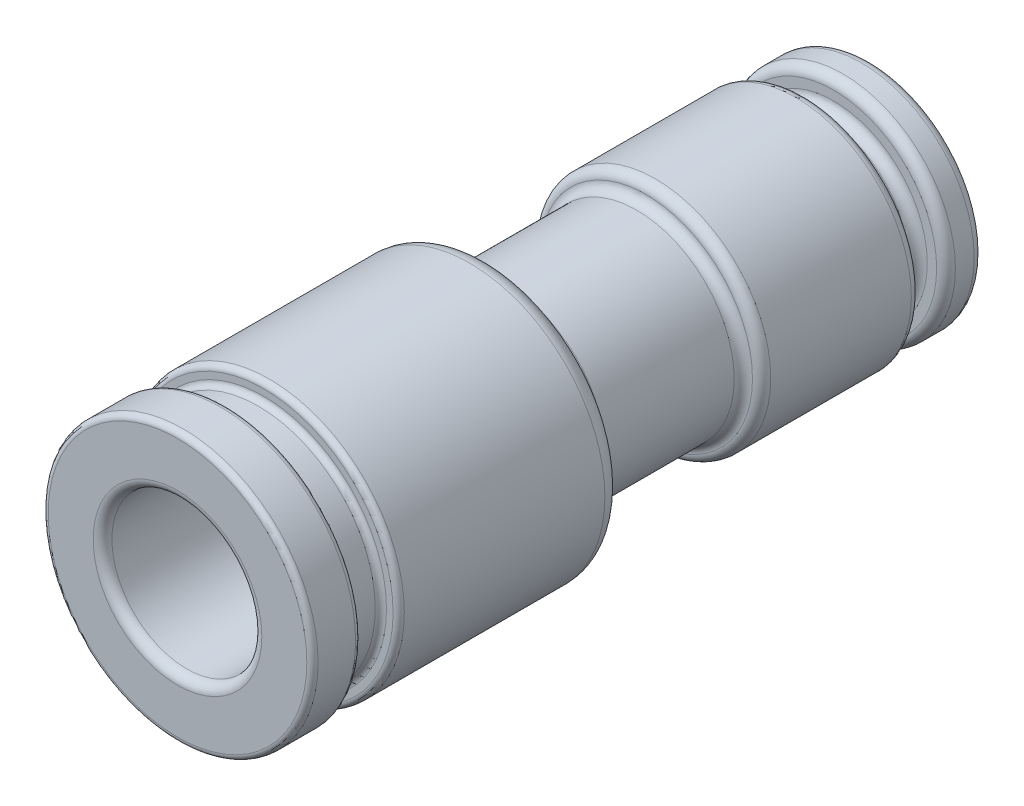
ISO-10303-21;
HEADER;
FILE_DESCRIPTION(('STEP AP214'),'2;1');
FILE_NAME('part.step','',(''),(''),'','','');
FILE_SCHEMA(('AUTOMOTIVE_DESIGN { 1 0 10303 214 1 1 1 1 }'));
ENDSEC;
DATA;
#1=APPLICATION_CONTEXT('core data for automotive mechanical design processes');
#2=APPLICATION_PROTOCOL_DEFINITION('international standard','automotive_design',2000,#1);
#3=PRODUCT_CONTEXT('',#1,'mechanical');
#4=PRODUCT('Part','Part','',(#3));
#5=PRODUCT_RELATED_PRODUCT_CATEGORY('part','',(#4));
#6=PRODUCT_DEFINITION_FORMATION('','',#4);
#7=PRODUCT_DEFINITION_CONTEXT('part definition',#1,'design');
#8=PRODUCT_DEFINITION('design','',#6,#7);
#9=PRODUCT_DEFINITION_SHAPE('','',#8);
#10=(LENGTH_UNIT() NAMED_UNIT(*) SI_UNIT(.MILLI.,.METRE.));
#11=(NAMED_UNIT(*) PLANE_ANGLE_UNIT() SI_UNIT($,.RADIAN.));
#12=(NAMED_UNIT(*) SI_UNIT($,.STERADIAN.) SOLID_ANGLE_UNIT());
#13=UNCERTAINTY_MEASURE_WITH_UNIT(LENGTH_MEASURE(1.E-05),#10,'distance_accuracy_value','');
#14=(GEOMETRIC_REPRESENTATION_CONTEXT(3) GLOBAL_UNCERTAINTY_ASSIGNED_CONTEXT((#13)) GLOBAL_UNIT_ASSIGNED_CONTEXT((#10,
#11,#12)) REPRESENTATION_CONTEXT('',''));
#15=CARTESIAN_POINT('',(0.,0.,0.));
#16=DIRECTION('',(0.,0.,1.));
#17=DIRECTION('',(1.,0.,0.));
#18=AXIS2_PLACEMENT_3D('',#15,#16,#17);
#19=CARTESIAN_POINT('',(0.,0.,2.));
#20=DIRECTION('',(0.,0.,-1.));
#21=DIRECTION('',(-1.,0.,0.));
#22=AXIS2_PLACEMENT_3D('',#19,#20,#21);
#23=CYLINDRICAL_SURFACE('',#22,6.);
#24=CARTESIAN_POINT('',(0.,0.,0.5));
#25=DIRECTION('',(0.,0.,1.));
#26=DIRECTION('',(1.,0.,0.));
#27=AXIS2_PLACEMENT_3D('',#24,#25,#26);
#28=CIRCLE('',#27,6.);
#29=CARTESIAN_POINT('',(6.,0.,0.5));
#30=VERTEX_POINT('',#29);
#31=EDGE_CURVE('E99',#30,#30,#28,.T.);
#32=ORIENTED_EDGE('',*,*,#31,.T.);
#33=EDGE_LOOP('',(#32));
#34=FACE_BOUND('',#33,.T.);
#35=CARTESIAN_POINT('',(0.,0.,1.5));
#36=DIRECTION('',(0.,0.,1.));
#37=DIRECTION('',(1.,0.,0.));
#38=AXIS2_PLACEMENT_3D('',#35,#36,#37);
#39=CIRCLE('',#38,6.);
#40=CARTESIAN_POINT('',(6.,0.,1.5));
#41=VERTEX_POINT('',#40);
#42=EDGE_CURVE('E103',#41,#41,#39,.F.);
#43=ORIENTED_EDGE('',*,*,#42,.T.);
#44=EDGE_LOOP('',(#43));
#45=FACE_BOUND('',#44,.T.);
#46=ADVANCED_FACE('F43',(#34,#45),#23,.T.);
#47=CARTESIAN_POINT('',(0.,0.,2.));
#48=DIRECTION('',(0.,0.,1.));
#49=DIRECTION('',(1.,0.,0.));
#50=AXIS2_PLACEMENT_3D('',#47,#48,#49);
#51=PLANE('',#50);
#52=CARTESIAN_POINT('',(0.,0.,2.));
#53=DIRECTION('',(0.,0.,1.));
#54=DIRECTION('',(1.,0.,0.));
#55=AXIS2_PLACEMENT_3D('',#52,#53,#54);
#56=CIRCLE('',#55,5.5);
#57=CARTESIAN_POINT('',(5.5,0.,2.));
#58=VERTEX_POINT('',#57);
#59=EDGE_CURVE('E87',#58,#58,#56,.T.);
#60=ORIENTED_EDGE('',*,*,#59,.T.);
#61=EDGE_LOOP('',(#60));
#62=FACE_BOUND('',#61,.T.);
#63=CARTESIAN_POINT('',(0.,0.,2.));
#64=DIRECTION('',(0.,0.,1.));
#65=DIRECTION('',(1.,0.,0.));
#66=AXIS2_PLACEMENT_3D('',#63,#64,#65);
#67=CIRCLE('',#66,5.);
#68=CARTESIAN_POINT('',(5.,0.,2.));
#69=VERTEX_POINT('',#68);
#70=EDGE_CURVE('E91',#69,#69,#67,.F.);
#71=ORIENTED_EDGE('',*,*,#70,.T.);
#72=EDGE_LOOP('',(#71));
#73=FACE_BOUND('',#72,.T.);
#74=ADVANCED_FACE('F203',(#62,#73),#51,.T.);
#75=CARTESIAN_POINT('',(0.,0.,0.));
#76=DIRECTION('',(0.,0.,1.));
#77=DIRECTION('',(1.,0.,0.));
#78=AXIS2_PLACEMENT_3D('',#75,#76,#77);
#79=PLANE('',#78);
#80=CARTESIAN_POINT('',(0.,0.,0.));
#81=DIRECTION('',(0.,0.,1.));
#82=DIRECTION('',(1.,0.,0.));
#83=AXIS2_PLACEMENT_3D('',#80,#81,#82);
#84=CIRCLE('',#83,3.5);
#85=CARTESIAN_POINT('',(3.5,0.,0.));
#86=VERTEX_POINT('',#85);
#87=EDGE_CURVE('E51',#86,#86,#84,.T.);
#88=ORIENTED_EDGE('',*,*,#87,.T.);
#89=EDGE_LOOP('',(#88));
#90=FACE_BOUND('',#89,.T.);
#91=CARTESIAN_POINT('',(0.,0.,0.));
#92=DIRECTION('',(0.,0.,1.));
#93=DIRECTION('',(1.,0.,0.));
#94=AXIS2_PLACEMENT_3D('',#91,#92,#93);
#95=CIRCLE('',#94,5.5);
#96=CARTESIAN_POINT('',(5.5,0.,0.));
#97=VERTEX_POINT('',#96);
#98=EDGE_CURVE('E95',#97,#97,#95,.F.);
#99=ORIENTED_EDGE('',*,*,#98,.T.);
#100=EDGE_LOOP('',(#99));
#101=FACE_BOUND('',#100,.T.);
#102=ADVANCED_FACE('F208',(#90,#101),#79,.F.);
#103=CARTESIAN_POINT('',(0.,0.,3.5));
#104=DIRECTION('',(0.,0.,-1.));
#105=DIRECTION('',(-1.,0.,0.));
#106=AXIS2_PLACEMENT_3D('',#103,#104,#105);
#107=CYLINDRICAL_SURFACE('',#106,4.5);
#108=CARTESIAN_POINT('',(0.,0.,2.5));
#109=DIRECTION('',(0.,0.,1.));
#110=DIRECTION('',(1.,0.,0.));
#111=AXIS2_PLACEMENT_3D('',#108,#109,#110);
#112=CIRCLE('',#111,4.5);
#113=CARTESIAN_POINT('',(4.5,0.,2.5));
#114=VERTEX_POINT('',#113);
#115=EDGE_CURVE('E79',#114,#114,#112,.T.);
#116=ORIENTED_EDGE('',*,*,#115,.T.);
#117=EDGE_LOOP('',(#116));
#118=FACE_BOUND('',#117,.T.);
#119=CARTESIAN_POINT('',(0.,0.,3.));
#120=DIRECTION('',(0.,0.,1.));
#121=DIRECTION('',(1.,0.,0.));
#122=AXIS2_PLACEMENT_3D('',#119,#120,#121);
#123=CIRCLE('',#122,4.5);
#124=CARTESIAN_POINT('',(4.5,0.,3.));
#125=VERTEX_POINT('',#124);
#126=EDGE_CURVE('E83',#125,#125,#123,.F.);
#127=ORIENTED_EDGE('',*,*,#126,.T.);
#128=EDGE_LOOP('',(#127));
#129=FACE_BOUND('',#128,.T.);
#130=ADVANCED_FACE('F214',(#118,#129),#107,.T.);
#131=CARTESIAN_POINT('',(0.,0.,12.));
#132=DIRECTION('',(0.,0.,-1.));
#133=DIRECTION('',(-1.,0.,0.));
#134=AXIS2_PLACEMENT_3D('',#131,#132,#133);
#135=CYLINDRICAL_SURFACE('',#134,6.15);
#136=CARTESIAN_POINT('',(0.,0.,4.));
#137=DIRECTION('',(0.,0.,1.));
#138=DIRECTION('',(1.,0.,0.));
#139=AXIS2_PLACEMENT_3D('',#136,#137,#138);
#140=CIRCLE('',#139,6.15);
#141=CARTESIAN_POINT('',(6.15,0.,4.));
#142=VERTEX_POINT('',#141);
#143=EDGE_CURVE('E115',#142,#142,#140,.T.);
#144=ORIENTED_EDGE('',*,*,#143,.T.);
#145=EDGE_LOOP('',(#144));
#146=FACE_BOUND('',#145,.T.);
#147=CARTESIAN_POINT('',(0.,0.,11.5012507822281));
#148=DIRECTION('',(0.,0.,-1.));
#149=DIRECTION('',(-1.,0.,0.));
#150=AXIS2_PLACEMENT_3D('',#147,#148,#149);
#151=CIRCLE('',#150,6.15);
#152=CARTESIAN_POINT('',(-6.15,0.,11.5012507822281));
#153=VERTEX_POINT('',#152);
#154=EDGE_CURVE('E171',#153,#153,#151,.T.);
#155=ORIENTED_EDGE('',*,*,#154,.T.);
#156=EDGE_LOOP('',(#155));
#157=FACE_BOUND('',#156,.T.);
#158=ADVANCED_FACE('F218',(#146,#157),#135,.T.);
#159=CARTESIAN_POINT('',(0.,0.,3.5));
#160=DIRECTION('',(0.,0.,1.));
#161=DIRECTION('',(1.,0.,0.));
#162=AXIS2_PLACEMENT_3D('',#159,#160,#161);
#163=PLANE('',#162);
#164=CARTESIAN_POINT('',(0.,0.,3.5));
#165=DIRECTION('',(0.,0.,1.));
#166=DIRECTION('',(1.,0.,0.));
#167=AXIS2_PLACEMENT_3D('',#164,#165,#166);
#168=CIRCLE('',#167,5.65);
#169=CARTESIAN_POINT('',(5.65,0.,3.5));
#170=VERTEX_POINT('',#169);
#171=EDGE_CURVE('E107',#170,#170,#168,.F.);
#172=ORIENTED_EDGE('',*,*,#171,.T.);
#173=EDGE_LOOP('',(#172));
#174=FACE_BOUND('',#173,.T.);
#175=CARTESIAN_POINT('',(0.,0.,3.5));
#176=DIRECTION('',(0.,0.,1.));
#177=DIRECTION('',(1.,0.,0.));
#178=AXIS2_PLACEMENT_3D('',#175,#176,#177);
#179=CIRCLE('',#178,5.);
#180=CARTESIAN_POINT('',(5.,0.,3.5));
#181=VERTEX_POINT('',#180);
#182=EDGE_CURVE('E111',#181,#181,#179,.T.);
#183=ORIENTED_EDGE('',*,*,#182,.T.);
#184=EDGE_LOOP('',(#183));
#185=FACE_BOUND('',#184,.T.);
#186=ADVANCED_FACE('F198',(#174,#185),#163,.F.);
#187=CARTESIAN_POINT('',(0.,0.,20.4));
#188=DIRECTION('',(0.,0.,-1.));
#189=DIRECTION('',(-1.,0.,0.));
#190=AXIS2_PLACEMENT_3D('',#187,#188,#189);
#191=CYLINDRICAL_SURFACE('',#190,5.2);
#192=CARTESIAN_POINT('',(0.,0.,19.4));
#193=DIRECTION('',(0.,0.,1.));
#194=DIRECTION('',(1.,0.,0.));
#195=AXIS2_PLACEMENT_3D('',#192,#193,#194);
#196=CIRCLE('',#195,5.2);
#197=CARTESIAN_POINT('',(5.2,0.,19.4));
#198=VERTEX_POINT('',#197);
#199=EDGE_CURVE('E163',#198,#198,#196,.F.);
#200=ORIENTED_EDGE('',*,*,#199,.T.);
#201=EDGE_LOOP('',(#200));
#202=FACE_BOUND('',#201,.T.);
#203=CARTESIAN_POINT('',(0.,0.,12.5));
#204=DIRECTION('',(0.,0.,1.));
#205=DIRECTION('',(1.,0.,0.));
#206=AXIS2_PLACEMENT_3D('',#203,#204,#205);
#207=CIRCLE('',#206,5.2);
#208=CARTESIAN_POINT('',(5.2,0.,12.5));
#209=VERTEX_POINT('',#208);
#210=EDGE_CURVE('E179',#209,#209,#207,.T.);
#211=ORIENTED_EDGE('',*,*,#210,.T.);
#212=EDGE_LOOP('',(#211));
#213=FACE_BOUND('',#212,.T.);
#214=ADVANCED_FACE('F184',(#202,#213),#191,.T.);
#215=CARTESIAN_POINT('',(0.,0.,12.5));
#216=DIRECTION('',(0.,0.,1.));
#217=DIRECTION('',(1.,0.,0.));
#218=AXIS2_PLACEMENT_3D('',#215,#216,#217);
#219=TOROIDAL_SURFACE('',#218,5.7,0.5);
#220=CARTESIAN_POINT('',(0.,0.,12.0006253911128));
#221=DIRECTION('',(0.,0.,1.));
#222=DIRECTION('',(1.,0.,0.));
#223=AXIS2_PLACEMENT_3D('',#220,#221,#222);
#224=CIRCLE('',#223,5.67499999999994);
#225=CARTESIAN_POINT('',(5.67499999999994,0.,12.0006253911128));
#226=VERTEX_POINT('',#225);
#227=EDGE_CURVE('E175',#226,#226,#224,.T.);
#228=ORIENTED_EDGE('',*,*,#227,.T.);
#229=EDGE_LOOP('',(#228));
#230=FACE_BOUND('',#229,.T.);
#231=ORIENTED_EDGE('',*,*,#210,.F.);
#232=EDGE_LOOP('',(#231));
#233=FACE_BOUND('',#232,.T.);
#234=ADVANCED_FACE('F186',(#230,#233),#219,.F.);
#235=CARTESIAN_POINT('',(0.,0.,11.5012507822281));
#236=DIRECTION('',(0.,0.,-1.));
#237=DIRECTION('',(-1.,0.,0.));
#238=AXIS2_PLACEMENT_3D('',#235,#236,#237);
#239=TOROIDAL_SURFACE('',#238,5.65,0.5);
#240=ORIENTED_EDGE('',*,*,#154,.F.);
#241=EDGE_LOOP('',(#240));
#242=FACE_BOUND('',#241,.T.);
#243=ORIENTED_EDGE('',*,*,#227,.F.);
#244=EDGE_LOOP('',(#243));
#245=FACE_BOUND('',#244,.T.);
#246=ADVANCED_FACE('F188',(#242,#245),#239,.T.);
#247=CARTESIAN_POINT('',(0.,0.,32.4));
#248=DIRECTION('',(0.,0.,-1.));
#249=DIRECTION('',(-1.,0.,0.));
#250=AXIS2_PLACEMENT_3D('',#247,#248,#249);
#251=CYLINDRICAL_SURFACE('',#250,7.2);
#252=CARTESIAN_POINT('',(0.,0.,32.1));
#253=DIRECTION('',(0.,0.,1.));
#254=DIRECTION('',(1.,0.,0.));
#255=AXIS2_PLACEMENT_3D('',#252,#253,#254);
#256=CIRCLE('',#255,7.2);
#257=CARTESIAN_POINT('',(7.2,0.,32.1));
#258=VERTEX_POINT('',#257);
#259=EDGE_CURVE('E135',#258,#258,#256,.F.);
#260=ORIENTED_EDGE('',*,*,#259,.T.);
#261=EDGE_LOOP('',(#260));
#262=FACE_BOUND('',#261,.T.);
#263=CARTESIAN_POINT('',(0.,0.,21.4));
#264=DIRECTION('',(0.,0.,1.));
#265=DIRECTION('',(1.,0.,0.));
#266=AXIS2_PLACEMENT_3D('',#263,#264,#265);
#267=CIRCLE('',#266,7.2);
#268=CARTESIAN_POINT('',(7.2,0.,21.4));
#269=VERTEX_POINT('',#268);
#270=EDGE_CURVE('E159',#269,#269,#267,.T.);
#271=ORIENTED_EDGE('',*,*,#270,.T.);
#272=EDGE_LOOP('',(#271));
#273=FACE_BOUND('',#272,.T.);
#274=ADVANCED_FACE('F195',(#262,#273),#251,.T.);
#275=CARTESIAN_POINT('',(0.,0.,32.4));
#276=DIRECTION('',(0.,0.,1.));
#277=DIRECTION('',(1.,0.,0.));
#278=AXIS2_PLACEMENT_3D('',#275,#276,#277);
#279=PLANE('',#278);
#280=CARTESIAN_POINT('',(0.,0.,32.4));
#281=DIRECTION('',(0.,0.,1.));
#282=DIRECTION('',(1.,0.,0.));
#283=AXIS2_PLACEMENT_3D('',#280,#281,#282);
#284=CIRCLE('',#283,6.9);
#285=CARTESIAN_POINT('',(6.9,0.,32.4));
#286=VERTEX_POINT('',#285);
#287=EDGE_CURVE('E139',#286,#286,#284,.T.);
#288=ORIENTED_EDGE('',*,*,#287,.T.);
#289=EDGE_LOOP('',(#288));
#290=FACE_BOUND('',#289,.T.);
#291=CARTESIAN_POINT('',(0.,0.,32.4));
#292=DIRECTION('',(0.,0.,1.));
#293=DIRECTION('',(1.,0.,0.));
#294=AXIS2_PLACEMENT_3D('',#291,#292,#293);
#295=CIRCLE('',#294,6.55);
#296=CARTESIAN_POINT('',(6.55,0.,32.4));
#297=VERTEX_POINT('',#296);
#298=EDGE_CURVE('E147',#297,#297,#295,.F.);
#299=ORIENTED_EDGE('',*,*,#298,.T.);
#300=EDGE_LOOP('',(#299));
#301=FACE_BOUND('',#300,.T.);
#302=ADVANCED_FACE('F228',(#290,#301),#279,.T.);
#303=CARTESIAN_POINT('',(0.,0.,19.4));
#304=DIRECTION('',(0.,0.,1.));
#305=DIRECTION('',(1.,0.,0.));
#306=AXIS2_PLACEMENT_3D('',#303,#304,#305);
#307=TOROIDAL_SURFACE('',#306,6.2,1.);
#308=ORIENTED_EDGE('',*,*,#199,.F.);
#309=EDGE_LOOP('',(#308));
#310=FACE_BOUND('',#309,.T.);
#311=CARTESIAN_POINT('',(0.,0.,20.4));
#312=DIRECTION('',(0.,0.,1.));
#313=DIRECTION('',(1.,0.,0.));
#314=AXIS2_PLACEMENT_3D('',#311,#312,#313);
#315=CIRCLE('',#314,6.2);
#316=CARTESIAN_POINT('',(6.2,0.,20.4));
#317=VERTEX_POINT('',#316);
#318=EDGE_CURVE('E167',#317,#317,#315,.T.);
#319=ORIENTED_EDGE('',*,*,#318,.F.);
#320=EDGE_LOOP('',(#319));
#321=FACE_BOUND('',#320,.T.);
#322=ADVANCED_FACE('F232',(#310,#321),#307,.F.);
#323=CARTESIAN_POINT('',(0.,0.,21.4));
#324=DIRECTION('',(0.,0.,1.));
#325=DIRECTION('',(1.,0.,0.));
#326=AXIS2_PLACEMENT_3D('',#323,#324,#325);
#327=TOROIDAL_SURFACE('',#326,6.2,1.);
#328=ORIENTED_EDGE('',*,*,#318,.T.);
#329=EDGE_LOOP('',(#328));
#330=FACE_BOUND('',#329,.T.);
#331=ORIENTED_EDGE('',*,*,#270,.F.);
#332=EDGE_LOOP('',(#331));
#333=FACE_BOUND('',#332,.T.);
#334=ADVANCED_FACE('F238',(#330,#333),#327,.T.);
#335=CARTESIAN_POINT('',(0.,0.,34.4));
#336=DIRECTION('',(0.,0.,-1.));
#337=DIRECTION('',(-1.,0.,0.));
#338=AXIS2_PLACEMENT_3D('',#335,#336,#337);
#339=CYLINDRICAL_SURFACE('',#338,6.25);
#340=CARTESIAN_POINT('',(0.,0.,32.7));
#341=DIRECTION('',(0.,0.,1.));
#342=DIRECTION('',(1.,0.,0.));
#343=AXIS2_PLACEMENT_3D('',#340,#341,#342);
#344=CIRCLE('',#343,6.25);
#345=CARTESIAN_POINT('',(6.25,0.,32.7));
#346=VERTEX_POINT('',#345);
#347=EDGE_CURVE('E151',#346,#346,#344,.T.);
#348=ORIENTED_EDGE('',*,*,#347,.T.);
#349=EDGE_LOOP('',(#348));
#350=FACE_BOUND('',#349,.T.);
#351=CARTESIAN_POINT('',(0.,0.,34.1));
#352=DIRECTION('',(0.,0.,1.));
#353=DIRECTION('',(1.,0.,0.));
#354=AXIS2_PLACEMENT_3D('',#351,#352,#353);
#355=CIRCLE('',#354,6.25);
#356=CARTESIAN_POINT('',(6.25,0.,34.1));
#357=VERTEX_POINT('',#356);
#358=EDGE_CURVE('E155',#357,#357,#355,.F.);
#359=ORIENTED_EDGE('',*,*,#358,.T.);
#360=EDGE_LOOP('',(#359));
#361=FACE_BOUND('',#360,.T.);
#362=ADVANCED_FACE('F234',(#350,#361),#339,.T.);
#363=CARTESIAN_POINT('',(0.,0.,94.3646752981726));
#364=DIRECTION('',(0.,0.,-1.));
#365=DIRECTION('',(-1.,0.,0.));
#366=AXIS2_PLACEMENT_3D('',#363,#364,#365);
#367=CYLINDRICAL_SURFACE('',#366,7.2);
#368=CARTESIAN_POINT('',(0.,0.,36.7));
#369=DIRECTION('',(0.,0.,1.));
#370=DIRECTION('',(1.,0.,0.));
#371=AXIS2_PLACEMENT_3D('',#368,#369,#370);
#372=CIRCLE('',#371,7.2);
#373=CARTESIAN_POINT('',(7.2,0.,36.7));
#374=VERTEX_POINT('',#373);
#375=EDGE_CURVE('E123',#374,#374,#372,.F.);
#376=ORIENTED_EDGE('',*,*,#375,.T.);
#377=EDGE_LOOP('',(#376));
#378=FACE_BOUND('',#377,.T.);
#379=CARTESIAN_POINT('',(0.,0.,34.7));
#380=DIRECTION('',(0.,0.,1.));
#381=DIRECTION('',(1.,0.,0.));
#382=AXIS2_PLACEMENT_3D('',#379,#380,#381);
#383=CIRCLE('',#382,7.2);
#384=CARTESIAN_POINT('',(7.2,0.,34.7));
#385=VERTEX_POINT('',#384);
#386=EDGE_CURVE('E127',#385,#385,#383,.T.);
#387=ORIENTED_EDGE('',*,*,#386,.T.);
#388=EDGE_LOOP('',(#387));
#389=FACE_BOUND('',#388,.T.);
#390=ADVANCED_FACE('F237',(#378,#389),#367,.T.);
#391=CARTESIAN_POINT('',(0.,0.,34.4));
#392=DIRECTION('',(0.,0.,1.));
#393=DIRECTION('',(1.,0.,0.));
#394=AXIS2_PLACEMENT_3D('',#391,#392,#393);
#395=PLANE('',#394);
#396=CARTESIAN_POINT('',(0.,0.,34.4));
#397=DIRECTION('',(0.,0.,1.));
#398=DIRECTION('',(1.,0.,0.));
#399=AXIS2_PLACEMENT_3D('',#396,#397,#398);
#400=CIRCLE('',#399,6.9);
#401=CARTESIAN_POINT('',(6.9,0.,34.4));
#402=VERTEX_POINT('',#401);
#403=EDGE_CURVE('E119',#402,#402,#400,.F.);
#404=ORIENTED_EDGE('',*,*,#403,.T.);
#405=EDGE_LOOP('',(#404));
#406=FACE_BOUND('',#405,.T.);
#407=CARTESIAN_POINT('',(0.,0.,34.4));
#408=DIRECTION('',(0.,0.,1.));
#409=DIRECTION('',(1.,0.,0.));
#410=AXIS2_PLACEMENT_3D('',#407,#408,#409);
#411=CIRCLE('',#410,6.55);
#412=CARTESIAN_POINT('',(6.55,0.,34.4));
#413=VERTEX_POINT('',#412);
#414=EDGE_CURVE('E143',#413,#413,#411,.T.);
#415=ORIENTED_EDGE('',*,*,#414,.T.);
#416=EDGE_LOOP('',(#415));
#417=FACE_BOUND('',#416,.T.);
#418=ADVANCED_FACE('F244',(#406,#417),#395,.F.);
#419=CARTESIAN_POINT('',(0.,0.,37.));
#420=DIRECTION('',(0.,0.,1.));
#421=DIRECTION('',(1.,0.,0.));
#422=AXIS2_PLACEMENT_3D('',#419,#420,#421);
#423=PLANE('',#422);
#424=CARTESIAN_POINT('',(0.,0.,37.));
#425=DIRECTION('',(0.,0.,1.));
#426=DIRECTION('',(1.,0.,0.));
#427=AXIS2_PLACEMENT_3D('',#424,#425,#426);
#428=CIRCLE('',#427,4.5);
#429=CARTESIAN_POINT('',(4.5,0.,37.));
#430=VERTEX_POINT('',#429);
#431=EDGE_CURVE('E56',#430,#430,#428,.F.);
#432=ORIENTED_EDGE('',*,*,#431,.T.);
#433=EDGE_LOOP('',(#432));
#434=FACE_BOUND('',#433,.T.);
#435=CARTESIAN_POINT('',(0.,0.,37.));
#436=DIRECTION('',(0.,0.,1.));
#437=DIRECTION('',(1.,0.,0.));
#438=AXIS2_PLACEMENT_3D('',#435,#436,#437);
#439=CIRCLE('',#438,6.9);
#440=CARTESIAN_POINT('',(6.9,0.,37.));
#441=VERTEX_POINT('',#440);
#442=EDGE_CURVE('E131',#441,#441,#439,.T.);
#443=ORIENTED_EDGE('',*,*,#442,.T.);
#444=EDGE_LOOP('',(#443));
#445=FACE_BOUND('',#444,.T.);
#446=ADVANCED_FACE('F240',(#434,#445),#423,.T.);
#447=CARTESIAN_POINT('',(0.,0.,32.7));
#448=DIRECTION('',(0.,0.,1.));
#449=DIRECTION('',(1.,0.,0.));
#450=AXIS2_PLACEMENT_3D('',#447,#448,#449);
#451=TOROIDAL_SURFACE('',#450,6.55,0.3);
#452=ORIENTED_EDGE('',*,*,#298,.F.);
#453=EDGE_LOOP('',(#452));
#454=FACE_BOUND('',#453,.T.);
#455=ORIENTED_EDGE('',*,*,#347,.F.);
#456=EDGE_LOOP('',(#455));
#457=FACE_BOUND('',#456,.T.);
#458=ADVANCED_FACE('F243',(#454,#457),#451,.F.);
#459=CARTESIAN_POINT('',(0.,0.,34.1));
#460=DIRECTION('',(0.,0.,1.));
#461=DIRECTION('',(1.,0.,0.));
#462=AXIS2_PLACEMENT_3D('',#459,#460,#461);
#463=TOROIDAL_SURFACE('',#462,6.55,0.3);
#464=ORIENTED_EDGE('',*,*,#358,.F.);
#465=EDGE_LOOP('',(#464));
#466=FACE_BOUND('',#465,.T.);
#467=ORIENTED_EDGE('',*,*,#414,.F.);
#468=EDGE_LOOP('',(#467));
#469=FACE_BOUND('',#468,.T.);
#470=ADVANCED_FACE('F306',(#466,#469),#463,.F.);
#471=CARTESIAN_POINT('',(0.,0.,32.1));
#472=DIRECTION('',(0.,0.,1.));
#473=DIRECTION('',(1.,0.,0.));
#474=AXIS2_PLACEMENT_3D('',#471,#472,#473);
#475=TOROIDAL_SURFACE('',#474,6.9,0.3);
#476=ORIENTED_EDGE('',*,*,#259,.F.);
#477=EDGE_LOOP('',(#476));
#478=FACE_BOUND('',#477,.T.);
#479=ORIENTED_EDGE('',*,*,#287,.F.);
#480=EDGE_LOOP('',(#479));
#481=FACE_BOUND('',#480,.T.);
#482=ADVANCED_FACE('F296',(#478,#481),#475,.T.);
#483=CARTESIAN_POINT('',(0.,0.,36.7));
#484=DIRECTION('',(0.,0.,1.));
#485=DIRECTION('',(1.,0.,0.));
#486=AXIS2_PLACEMENT_3D('',#483,#484,#485);
#487=TOROIDAL_SURFACE('',#486,6.9,0.3);
#488=ORIENTED_EDGE('',*,*,#375,.F.);
#489=EDGE_LOOP('',(#488));
#490=FACE_BOUND('',#489,.T.);
#491=ORIENTED_EDGE('',*,*,#442,.F.);
#492=EDGE_LOOP('',(#491));
#493=FACE_BOUND('',#492,.T.);
#494=ADVANCED_FACE('F293',(#490,#493),#487,.T.);
#495=CARTESIAN_POINT('',(0.,0.,34.7));
#496=DIRECTION('',(0.,0.,1.));
#497=DIRECTION('',(1.,0.,0.));
#498=AXIS2_PLACEMENT_3D('',#495,#496,#497);
#499=TOROIDAL_SURFACE('',#498,6.9,0.3);
#500=ORIENTED_EDGE('',*,*,#403,.F.);
#501=EDGE_LOOP('',(#500));
#502=FACE_BOUND('',#501,.T.);
#503=ORIENTED_EDGE('',*,*,#386,.F.);
#504=EDGE_LOOP('',(#503));
#505=FACE_BOUND('',#504,.T.);
#506=ADVANCED_FACE('F295',(#502,#505),#499,.T.);
#507=CARTESIAN_POINT('',(0.,0.,4.));
#508=DIRECTION('',(0.,0.,1.));
#509=DIRECTION('',(1.,0.,0.));
#510=AXIS2_PLACEMENT_3D('',#507,#508,#509);
#511=TOROIDAL_SURFACE('',#510,5.65,0.5);
#512=ORIENTED_EDGE('',*,*,#171,.F.);
#513=EDGE_LOOP('',(#512));
#514=FACE_BOUND('',#513,.T.);
#515=ORIENTED_EDGE('',*,*,#143,.F.);
#516=EDGE_LOOP('',(#515));
#517=FACE_BOUND('',#516,.T.);
#518=ADVANCED_FACE('F303',(#514,#517),#511,.T.);
#519=CARTESIAN_POINT('',(0.,0.,0.5));
#520=DIRECTION('',(0.,0.,1.));
#521=DIRECTION('',(1.,0.,0.));
#522=AXIS2_PLACEMENT_3D('',#519,#520,#521);
#523=TOROIDAL_SURFACE('',#522,5.5,0.5);
#524=ORIENTED_EDGE('',*,*,#98,.F.);
#525=EDGE_LOOP('',(#524));
#526=FACE_BOUND('',#525,.T.);
#527=ORIENTED_EDGE('',*,*,#31,.F.);
#528=EDGE_LOOP('',(#527));
#529=FACE_BOUND('',#528,.T.);
#530=ADVANCED_FACE('F314',(#526,#529),#523,.T.);
#531=CARTESIAN_POINT('',(0.,0.,1.5));
#532=DIRECTION('',(0.,0.,1.));
#533=DIRECTION('',(1.,0.,0.));
#534=AXIS2_PLACEMENT_3D('',#531,#532,#533);
#535=TOROIDAL_SURFACE('',#534,5.5,0.5);
#536=ORIENTED_EDGE('',*,*,#42,.F.);
#537=EDGE_LOOP('',(#536));
#538=FACE_BOUND('',#537,.T.);
#539=ORIENTED_EDGE('',*,*,#59,.F.);
#540=EDGE_LOOP('',(#539));
#541=FACE_BOUND('',#540,.T.);
#542=ADVANCED_FACE('F318',(#538,#541),#535,.T.);
#543=CARTESIAN_POINT('',(0.,0.,2.5));
#544=DIRECTION('',(0.,0.,1.));
#545=DIRECTION('',(1.,0.,0.));
#546=AXIS2_PLACEMENT_3D('',#543,#544,#545);
#547=TOROIDAL_SURFACE('',#546,5.,0.5);
#548=ORIENTED_EDGE('',*,*,#70,.F.);
#549=EDGE_LOOP('',(#548));
#550=FACE_BOUND('',#549,.T.);
#551=ORIENTED_EDGE('',*,*,#115,.F.);
#552=EDGE_LOOP('',(#551));
#553=FACE_BOUND('',#552,.T.);
#554=ADVANCED_FACE('F321',(#550,#553),#547,.F.);
#555=CARTESIAN_POINT('',(0.,0.,3.));
#556=DIRECTION('',(0.,0.,1.));
#557=DIRECTION('',(1.,0.,0.));
#558=AXIS2_PLACEMENT_3D('',#555,#556,#557);
#559=TOROIDAL_SURFACE('',#558,5.,0.5);
#560=ORIENTED_EDGE('',*,*,#126,.F.);
#561=EDGE_LOOP('',(#560));
#562=FACE_BOUND('',#561,.T.);
#563=ORIENTED_EDGE('',*,*,#182,.F.);
#564=EDGE_LOOP('',(#563));
#565=FACE_BOUND('',#564,.T.);
#566=ADVANCED_FACE('F256',(#562,#565),#559,.F.);
#567=CARTESIAN_POINT('',(0.,0.,22.));
#568=DIRECTION('',(0.,0.,1.));
#569=DIRECTION('',(1.,0.,0.));
#570=AXIS2_PLACEMENT_3D('',#567,#568,#569);
#571=CYLINDRICAL_SURFACE('',#570,4.);
#572=CARTESIAN_POINT('',(0.,0.,36.5));
#573=DIRECTION('',(0.,0.,1.));
#574=DIRECTION('',(1.,0.,0.));
#575=AXIS2_PLACEMENT_3D('',#572,#573,#574);
#576=CIRCLE('',#575,4.);
#577=CARTESIAN_POINT('',(4.,0.,36.5));
#578=VERTEX_POINT('',#577);
#579=EDGE_CURVE('E61',#578,#578,#576,.T.);
#580=ORIENTED_EDGE('',*,*,#579,.T.);
#581=EDGE_LOOP('',(#580));
#582=FACE_BOUND('',#581,.T.);
#583=CARTESIAN_POINT('',(0.,0.,22.7320508075693));
#584=DIRECTION('',(0.,0.,1.));
#585=DIRECTION('',(1.,0.,0.));
#586=AXIS2_PLACEMENT_3D('',#583,#584,#585);
#587=CIRCLE('',#586,4.);
#588=CARTESIAN_POINT('',(4.,0.,22.7320508075693));
#589=VERTEX_POINT('',#588);
#590=EDGE_CURVE('E67',#589,#589,#587,.F.);
#591=ORIENTED_EDGE('',*,*,#590,.T.);
#592=EDGE_LOOP('',(#591));
#593=FACE_BOUND('',#592,.T.);
#594=ADVANCED_FACE('F252',(#582,#593),#571,.F.);
#595=CARTESIAN_POINT('',(0.,0.,0.));
#596=DIRECTION('',(0.,0.,1.));
#597=DIRECTION('',(1.,0.,0.));
#598=AXIS2_PLACEMENT_3D('',#595,#596,#597);
#599=CYLINDRICAL_SURFACE('',#598,3.);
#600=CARTESIAN_POINT('',(0.,0.,0.5));
#601=DIRECTION('',(0.,0.,1.));
#602=DIRECTION('',(1.,0.,0.));
#603=AXIS2_PLACEMENT_3D('',#600,#601,#602);
#604=CIRCLE('',#603,3.);
#605=CARTESIAN_POINT('',(3.,0.,0.5));
#606=VERTEX_POINT('',#605);
#607=EDGE_CURVE('E11',#606,#606,#604,.F.);
#608=ORIENTED_EDGE('',*,*,#607,.T.);
#609=EDGE_LOOP('',(#608));
#610=FACE_BOUND('',#609,.T.);
#611=CARTESIAN_POINT('',(0.,0.,21.));
#612=DIRECTION('',(0.,0.,1.));
#613=DIRECTION('',(1.,0.,0.));
#614=AXIS2_PLACEMENT_3D('',#611,#612,#613);
#615=CIRCLE('',#614,3.);
#616=CARTESIAN_POINT('',(3.,0.,21.));
#617=VERTEX_POINT('',#616);
#618=EDGE_CURVE('E75',#617,#617,#615,.T.);
#619=ORIENTED_EDGE('',*,*,#618,.T.);
#620=EDGE_LOOP('',(#619));
#621=FACE_BOUND('',#620,.T.);
#622=ADVANCED_FACE('F255',(#610,#621),#599,.F.);
#623=CARTESIAN_POINT('',(0.,0.,21.));
#624=DIRECTION('',(0.,0.,1.));
#625=DIRECTION('',(1.,0.,0.));
#626=AXIS2_PLACEMENT_3D('',#623,#624,#625);
#627=TOROIDAL_SURFACE('',#626,4.,1.);
#628=CARTESIAN_POINT('',(0.,0.,21.8660254037845));
#629=DIRECTION('',(0.,0.,-1.));
#630=DIRECTION('',(-1.,0.,0.));
#631=AXIS2_PLACEMENT_3D('',#628,#629,#630);
#632=CIRCLE('',#631,3.50000000000015);
#633=CARTESIAN_POINT('',(-3.50000000000015,0.,21.8660254037845));
#634=VERTEX_POINT('',#633);
#635=EDGE_CURVE('E71',#634,#634,#632,.F.);
#636=ORIENTED_EDGE('',*,*,#635,.T.);
#637=EDGE_LOOP('',(#636));
#638=FACE_BOUND('',#637,.T.);
#639=ORIENTED_EDGE('',*,*,#618,.F.);
#640=EDGE_LOOP('',(#639));
#641=FACE_BOUND('',#640,.T.);
#642=ADVANCED_FACE('F259',(#638,#641),#627,.T.);
#643=CARTESIAN_POINT('',(0.,0.,22.7320508075693));
#644=DIRECTION('',(0.,0.,1.));
#645=DIRECTION('',(1.,0.,0.));
#646=AXIS2_PLACEMENT_3D('',#643,#644,#645);
#647=TOROIDAL_SURFACE('',#646,3.00000000000015,1.);
#648=ORIENTED_EDGE('',*,*,#590,.F.);
#649=EDGE_LOOP('',(#648));
#650=FACE_BOUND('',#649,.T.);
#651=ORIENTED_EDGE('',*,*,#635,.F.);
#652=EDGE_LOOP('',(#651));
#653=FACE_BOUND('',#652,.T.);
#654=ADVANCED_FACE('F263',(#650,#653),#647,.F.);
#655=CARTESIAN_POINT('',(0.,0.,36.5));
#656=DIRECTION('',(0.,0.,1.));
#657=DIRECTION('',(1.,0.,0.));
#658=AXIS2_PLACEMENT_3D('',#655,#656,#657);
#659=TOROIDAL_SURFACE('',#658,4.5,0.5);
#660=ORIENTED_EDGE('',*,*,#431,.F.);
#661=EDGE_LOOP('',(#660));
#662=FACE_BOUND('',#661,.T.);
#663=ORIENTED_EDGE('',*,*,#579,.F.);
#664=EDGE_LOOP('',(#663));
#665=FACE_BOUND('',#664,.T.);
#666=ADVANCED_FACE('F272',(#662,#665),#659,.T.);
#667=CARTESIAN_POINT('',(0.,0.,0.5));
#668=DIRECTION('',(0.,0.,1.));
#669=DIRECTION('',(1.,0.,0.));
#670=AXIS2_PLACEMENT_3D('',#667,#668,#669);
#671=TOROIDAL_SURFACE('',#670,3.5,0.5);
#672=ORIENTED_EDGE('',*,*,#607,.F.);
#673=EDGE_LOOP('',(#672));
#674=FACE_BOUND('',#673,.T.);
#675=ORIENTED_EDGE('',*,*,#87,.F.);
#676=EDGE_LOOP('',(#675));
#677=FACE_BOUND('',#676,.T.);
#678=ADVANCED_FACE('F45',(#674,#677),#671,.T.);
#679=CLOSED_SHELL('',(#46,#74,#102,#130,#158,#186,#214,#234,#246,#274,#302,#322,#334,#362,#390,
#418,#446,#458,#470,#482,#494,#506,#518,#530,#542,#554,#566,#594,#622,#642,#654,#666,#678));
#680=MANIFOLD_SOLID_BREP('B2',#679);
#681=ADVANCED_BREP_SHAPE_REPRESENTATION('',(#18,#680),#14);
#682=SHAPE_DEFINITION_REPRESENTATION(#9,#681);
ENDSEC;
END-ISO-10303-21;
